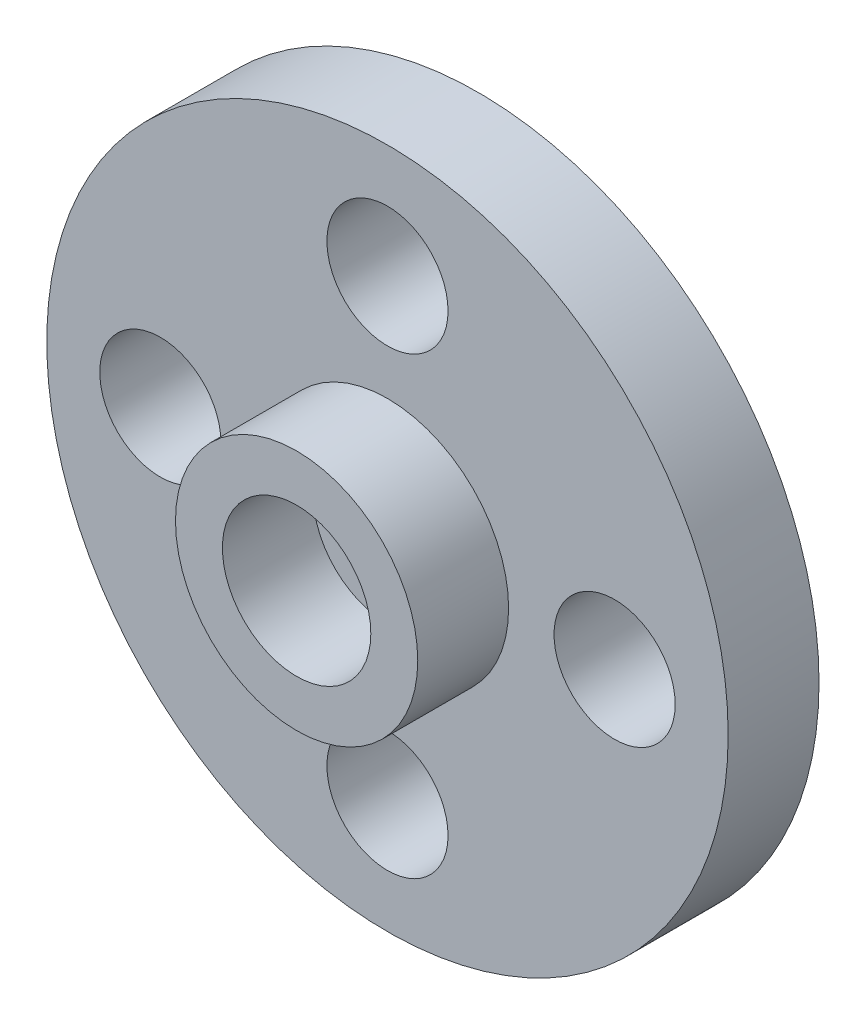
ISO-10303-21;
HEADER;
FILE_DESCRIPTION(('STEP AP214'),'2;1');
FILE_NAME('part.step','',(''),(''),'','','');
FILE_SCHEMA(('AUTOMOTIVE_DESIGN { 1 0 10303 214 1 1 1 1 }'));
ENDSEC;
DATA;
#1=APPLICATION_CONTEXT('core data for automotive mechanical design processes');
#2=APPLICATION_PROTOCOL_DEFINITION('international standard','automotive_design',2000,#1);
#3=PRODUCT_CONTEXT('',#1,'mechanical');
#4=PRODUCT('Part','Part','',(#3));
#5=PRODUCT_RELATED_PRODUCT_CATEGORY('part','',(#4));
#6=PRODUCT_DEFINITION_FORMATION('','',#4);
#7=PRODUCT_DEFINITION_CONTEXT('part definition',#1,'design');
#8=PRODUCT_DEFINITION('design','',#6,#7);
#9=PRODUCT_DEFINITION_SHAPE('','',#8);
#10=(LENGTH_UNIT() NAMED_UNIT(*) SI_UNIT(.MILLI.,.METRE.));
#11=(NAMED_UNIT(*) PLANE_ANGLE_UNIT() SI_UNIT($,.RADIAN.));
#12=(NAMED_UNIT(*) SI_UNIT($,.STERADIAN.) SOLID_ANGLE_UNIT());
#13=UNCERTAINTY_MEASURE_WITH_UNIT(LENGTH_MEASURE(1.E-05),#10,'distance_accuracy_value','');
#14=(GEOMETRIC_REPRESENTATION_CONTEXT(3) GLOBAL_UNCERTAINTY_ASSIGNED_CONTEXT((#13)) GLOBAL_UNIT_ASSIGNED_CONTEXT((#10,
#11,#12)) REPRESENTATION_CONTEXT('',''));
#15=CARTESIAN_POINT('',(0.,0.,0.));
#16=DIRECTION('',(0.,0.,1.));
#17=DIRECTION('',(1.,0.,0.));
#18=AXIS2_PLACEMENT_3D('',#15,#16,#17);
#19=CARTESIAN_POINT('',(0.,0.,-3.));
#20=DIRECTION('',(0.,0.,1.));
#21=DIRECTION('',(1.,0.,0.));
#22=AXIS2_PLACEMENT_3D('',#19,#20,#21);
#23=CYLINDRICAL_SURFACE('',#22,11.25);
#24=CARTESIAN_POINT('',(0.,0.,-3.));
#25=DIRECTION('',(0.,0.,1.));
#26=DIRECTION('',(1.,0.,0.));
#27=AXIS2_PLACEMENT_3D('',#24,#25,#26);
#28=CIRCLE('',#27,11.25);
#29=CARTESIAN_POINT('',(11.25,0.,-3.));
#30=VERTEX_POINT('',#29);
#31=EDGE_CURVE('E52',#30,#30,#28,.T.);
#32=ORIENTED_EDGE('',*,*,#31,.T.);
#33=EDGE_LOOP('',(#32));
#34=FACE_BOUND('',#33,.T.);
#35=CARTESIAN_POINT('',(0.,0.,0.));
#36=DIRECTION('',(0.,0.,1.));
#37=DIRECTION('',(1.,0.,0.));
#38=AXIS2_PLACEMENT_3D('',#35,#36,#37);
#39=CIRCLE('',#38,11.25);
#40=CARTESIAN_POINT('',(11.25,0.,0.));
#41=VERTEX_POINT('',#40);
#42=EDGE_CURVE('E59',#41,#41,#39,.T.);
#43=ORIENTED_EDGE('',*,*,#42,.F.);
#44=EDGE_LOOP('',(#43));
#45=FACE_BOUND('',#44,.T.);
#46=ADVANCED_FACE('F45',(#34,#45),#23,.T.);
#47=CARTESIAN_POINT('',(0.,0.,-3.));
#48=DIRECTION('',(0.,0.,1.));
#49=DIRECTION('',(1.,0.,0.));
#50=AXIS2_PLACEMENT_3D('',#47,#48,#49);
#51=PLANE('',#50);
#52=CARTESIAN_POINT('',(0.,7.5,-3.));
#53=DIRECTION('',(0.,0.,1.));
#54=DIRECTION('',(1.,0.,0.));
#55=AXIS2_PLACEMENT_3D('',#52,#53,#54);
#56=CIRCLE('',#55,2.);
#57=CARTESIAN_POINT('',(2.,7.5,-3.));
#58=VERTEX_POINT('',#57);
#59=EDGE_CURVE('E79',#58,#58,#56,.F.);
#60=ORIENTED_EDGE('',*,*,#59,.F.);
#61=EDGE_LOOP('',(#60));
#62=FACE_BOUND('',#61,.T.);
#63=CARTESIAN_POINT('',(7.5,0.,-3.));
#64=DIRECTION('',(0.,0.,1.));
#65=DIRECTION('',(1.,0.,0.));
#66=AXIS2_PLACEMENT_3D('',#63,#64,#65);
#67=CIRCLE('',#66,2.);
#68=CARTESIAN_POINT('',(9.5,0.,-3.));
#69=VERTEX_POINT('',#68);
#70=EDGE_CURVE('E103',#69,#69,#67,.F.);
#71=ORIENTED_EDGE('',*,*,#70,.F.);
#72=EDGE_LOOP('',(#71));
#73=FACE_BOUND('',#72,.T.);
#74=CARTESIAN_POINT('',(2.11325850529309E-13,-7.5,-3.));
#75=DIRECTION('',(0.,0.,1.));
#76=DIRECTION('',(1.,0.,0.));
#77=AXIS2_PLACEMENT_3D('',#74,#75,#76);
#78=CIRCLE('',#77,2.00000000000025);
#79=CARTESIAN_POINT('',(2.00000000000046,-7.5,-3.));
#80=VERTEX_POINT('',#79);
#81=EDGE_CURVE('E90',#80,#80,#78,.F.);
#82=ORIENTED_EDGE('',*,*,#81,.F.);
#83=EDGE_LOOP('',(#82));
#84=FACE_BOUND('',#83,.T.);
#85=CARTESIAN_POINT('',(-7.4999999999999,-1.06581410364015E-13,-3.));
#86=DIRECTION('',(0.,0.,1.));
#87=DIRECTION('',(1.,0.,0.));
#88=AXIS2_PLACEMENT_3D('',#85,#86,#87);
#89=CIRCLE('',#88,2.00000000000021);
#90=CARTESIAN_POINT('',(-5.49999999999969,-1.06581410364015E-13,-3.));
#91=VERTEX_POINT('',#90);
#92=EDGE_CURVE('E80',#91,#91,#89,.F.);
#93=ORIENTED_EDGE('',*,*,#92,.F.);
#94=EDGE_LOOP('',(#93));
#95=FACE_BOUND('',#94,.T.);
#96=ORIENTED_EDGE('',*,*,#31,.F.);
#97=EDGE_LOOP('',(#96));
#98=FACE_BOUND('',#97,.T.);
#99=ADVANCED_FACE('F129',(#62,#73,#84,#95,#98),#51,.F.);
#100=CARTESIAN_POINT('',(0.,0.,0.));
#101=DIRECTION('',(0.,0.,1.));
#102=DIRECTION('',(1.,0.,0.));
#103=AXIS2_PLACEMENT_3D('',#100,#101,#102);
#104=PLANE('',#103);
#105=CARTESIAN_POINT('',(0.,7.5,0.));
#106=DIRECTION('',(0.,0.,1.));
#107=DIRECTION('',(1.,0.,0.));
#108=AXIS2_PLACEMENT_3D('',#105,#106,#107);
#109=CIRCLE('',#108,2.);
#110=CARTESIAN_POINT('',(2.,7.5,0.));
#111=VERTEX_POINT('',#110);
#112=EDGE_CURVE('E114',#111,#111,#109,.T.);
#113=ORIENTED_EDGE('',*,*,#112,.F.);
#114=EDGE_LOOP('',(#113));
#115=FACE_BOUND('',#114,.T.);
#116=CARTESIAN_POINT('',(7.5,0.,0.));
#117=DIRECTION('',(0.,0.,1.));
#118=DIRECTION('',(1.,0.,0.));
#119=AXIS2_PLACEMENT_3D('',#116,#117,#118);
#120=CIRCLE('',#119,2.);
#121=CARTESIAN_POINT('',(9.5,0.,0.));
#122=VERTEX_POINT('',#121);
#123=EDGE_CURVE('E106',#122,#122,#120,.T.);
#124=ORIENTED_EDGE('',*,*,#123,.F.);
#125=EDGE_LOOP('',(#124));
#126=FACE_BOUND('',#125,.T.);
#127=CARTESIAN_POINT('',(2.11325850529309E-13,-7.5,0.));
#128=DIRECTION('',(0.,0.,1.));
#129=DIRECTION('',(1.,0.,0.));
#130=AXIS2_PLACEMENT_3D('',#127,#128,#129);
#131=CIRCLE('',#130,2.00000000000025);
#132=CARTESIAN_POINT('',(2.00000000000046,-7.5,0.));
#133=VERTEX_POINT('',#132);
#134=EDGE_CURVE('E84',#133,#133,#131,.T.);
#135=ORIENTED_EDGE('',*,*,#134,.F.);
#136=EDGE_LOOP('',(#135));
#137=FACE_BOUND('',#136,.T.);
#138=CARTESIAN_POINT('',(-7.4999999999999,-1.06581410364015E-13,0.));
#139=DIRECTION('',(0.,0.,1.));
#140=DIRECTION('',(1.,0.,0.));
#141=AXIS2_PLACEMENT_3D('',#138,#139,#140);
#142=CIRCLE('',#141,2.00000000000021);
#143=CARTESIAN_POINT('',(-5.49999999999969,-1.06581410364015E-13,0.));
#144=VERTEX_POINT('',#143);
#145=EDGE_CURVE('E85',#144,#144,#142,.T.);
#146=ORIENTED_EDGE('',*,*,#145,.F.);
#147=EDGE_LOOP('',(#146));
#148=FACE_BOUND('',#147,.T.);
#149=CARTESIAN_POINT('',(0.,0.,0.));
#150=DIRECTION('',(0.,0.,1.));
#151=DIRECTION('',(1.,0.,0.));
#152=AXIS2_PLACEMENT_3D('',#149,#150,#151);
#153=CIRCLE('',#152,4.);
#154=CARTESIAN_POINT('',(4.,0.,0.));
#155=VERTEX_POINT('',#154);
#156=EDGE_CURVE('E69',#155,#155,#153,.T.);
#157=ORIENTED_EDGE('',*,*,#156,.F.);
#158=EDGE_LOOP('',(#157));
#159=FACE_BOUND('',#158,.T.);
#160=ORIENTED_EDGE('',*,*,#42,.T.);
#161=EDGE_LOOP('',(#160));
#162=FACE_BOUND('',#161,.T.);
#163=ADVANCED_FACE('F132',(#115,#126,#137,#148,#159,#162),#104,.T.);
#164=CARTESIAN_POINT('',(0.,0.,3.));
#165=DIRECTION('',(0.,0.,1.));
#166=DIRECTION('',(1.,0.,0.));
#167=AXIS2_PLACEMENT_3D('',#164,#165,#166);
#168=PLANE('',#167);
#169=CARTESIAN_POINT('',(0.,0.,3.));
#170=DIRECTION('',(0.,0.,1.));
#171=DIRECTION('',(1.,0.,0.));
#172=AXIS2_PLACEMENT_3D('',#169,#170,#171);
#173=CIRCLE('',#172,4.);
#174=CARTESIAN_POINT('',(4.,0.,3.));
#175=VERTEX_POINT('',#174);
#176=EDGE_CURVE('E67',#175,#175,#173,.T.);
#177=ORIENTED_EDGE('',*,*,#176,.T.);
#178=EDGE_LOOP('',(#177));
#179=FACE_BOUND('',#178,.T.);
#180=CARTESIAN_POINT('',(0.,0.,3.));
#181=DIRECTION('',(0.,0.,1.));
#182=DIRECTION('',(1.,0.,0.));
#183=AXIS2_PLACEMENT_3D('',#180,#181,#182);
#184=CIRCLE('',#183,2.45);
#185=CARTESIAN_POINT('',(2.45,0.,3.));
#186=VERTEX_POINT('',#185);
#187=EDGE_CURVE('E72',#186,#186,#184,.T.);
#188=ORIENTED_EDGE('',*,*,#187,.F.);
#189=EDGE_LOOP('',(#188));
#190=FACE_BOUND('',#189,.T.);
#191=ADVANCED_FACE('F163',(#179,#190),#168,.T.);
#192=CARTESIAN_POINT('',(0.,0.,3.));
#193=DIRECTION('',(0.,0.,-1.));
#194=DIRECTION('',(-1.,0.,0.));
#195=AXIS2_PLACEMENT_3D('',#192,#193,#194);
#196=CYLINDRICAL_SURFACE('',#195,4.);
#197=ORIENTED_EDGE('',*,*,#176,.F.);
#198=EDGE_LOOP('',(#197));
#199=FACE_BOUND('',#198,.T.);
#200=ORIENTED_EDGE('',*,*,#156,.T.);
#201=EDGE_LOOP('',(#200));
#202=FACE_BOUND('',#201,.T.);
#203=ADVANCED_FACE('F168',(#199,#202),#196,.T.);
#204=CARTESIAN_POINT('',(0.,0.,3.));
#205=DIRECTION('',(0.,0.,-1.));
#206=DIRECTION('',(-1.,0.,0.));
#207=AXIS2_PLACEMENT_3D('',#204,#205,#206);
#208=CYLINDRICAL_SURFACE('',#207,2.45);
#209=ORIENTED_EDGE('',*,*,#187,.T.);
#210=EDGE_LOOP('',(#209));
#211=FACE_BOUND('',#210,.T.);
#212=CARTESIAN_POINT('',(0.,0.,0.));
#213=DIRECTION('',(0.,0.,1.));
#214=DIRECTION('',(1.,0.,0.));
#215=AXIS2_PLACEMENT_3D('',#212,#213,#214);
#216=CIRCLE('',#215,2.45);
#217=CARTESIAN_POINT('',(2.45,0.,0.));
#218=VERTEX_POINT('',#217);
#219=EDGE_CURVE('E11',#218,#218,#216,.F.);
#220=ORIENTED_EDGE('',*,*,#219,.T.);
#221=EDGE_LOOP('',(#220));
#222=FACE_BOUND('',#221,.T.);
#223=ADVANCED_FACE('F153',(#211,#222),#208,.F.);
#224=ORIENTED_EDGE('',*,*,#219,.F.);
#225=EDGE_LOOP('',(#224));
#226=FACE_BOUND('',#225,.T.);
#227=ADVANCED_FACE('F144',(#226),#104,.T.);
#228=CARTESIAN_POINT('',(-7.4999999999999,-1.06581410364015E-13,-3.001));
#229=DIRECTION('',(0.,0.,1.));
#230=DIRECTION('',(1.,0.,0.));
#231=AXIS2_PLACEMENT_3D('',#228,#229,#230);
#232=CYLINDRICAL_SURFACE('',#231,2.00000000000021);
#233=CARTESIAN_POINT('',(-5.49999999999969,-1.06581410364015E-13,0.));
#234=CARTESIAN_POINT('',(-5.49999999999969,-1.06581410364015E-13,-0.0312500000000005));
#235=CARTESIAN_POINT('',(-5.49999999999969,-1.06581410364015E-13,-0.0625000000000005));
#236=CARTESIAN_POINT('',(-5.49999999999969,-1.06581410364015E-13,-0.125000000000001));
#237=CARTESIAN_POINT('',(-5.49999999999969,-1.06581410364015E-13,-0.156250000000001));
#238=CARTESIAN_POINT('',(-5.49999999999969,-1.06581410364015E-13,-0.218750000000001));
#239=CARTESIAN_POINT('',(-5.49999999999969,-1.06581410364015E-13,-0.250000000000001));
#240=CARTESIAN_POINT('',(-5.49999999999969,-1.06581410364015E-13,-0.312500000000001));
#241=CARTESIAN_POINT('',(-5.49999999999969,-1.06581410364015E-13,-0.34375));
#242=CARTESIAN_POINT('',(-5.49999999999969,-1.06581410364015E-13,-0.40625));
#243=CARTESIAN_POINT('',(-5.49999999999969,-1.06581410364015E-13,-0.4375));
#244=CARTESIAN_POINT('',(-5.49999999999969,-1.06581410364015E-13,-0.5));
#245=CARTESIAN_POINT('',(-5.49999999999969,-1.06581410364015E-13,-0.53125));
#246=CARTESIAN_POINT('',(-5.49999999999969,-1.06581410364015E-13,-0.593750000000001));
#247=CARTESIAN_POINT('',(-5.49999999999969,-1.06581410364015E-13,-0.625000000000001));
#248=CARTESIAN_POINT('',(-5.49999999999969,-1.06581410364015E-13,-0.687500000000001));
#249=CARTESIAN_POINT('',(-5.49999999999969,-1.06581410364015E-13,-0.71875));
#250=CARTESIAN_POINT('',(-5.49999999999969,-1.06581410364015E-13,-0.78125));
#251=CARTESIAN_POINT('',(-5.49999999999969,-1.06581410364015E-13,-0.8125));
#252=CARTESIAN_POINT('',(-5.49999999999969,-1.06581410364015E-13,-0.875));
#253=CARTESIAN_POINT('',(-5.49999999999969,-1.06581410364015E-13,-0.90625));
#254=CARTESIAN_POINT('',(-5.49999999999969,-1.06581410364015E-13,-0.96875));
#255=CARTESIAN_POINT('',(-5.49999999999969,-1.06581410364015E-13,-1.));
#256=CARTESIAN_POINT('',(-5.49999999999969,-1.06581410364015E-13,-1.0625));
#257=CARTESIAN_POINT('',(-5.49999999999969,-1.06581410364015E-13,-1.09375));
#258=CARTESIAN_POINT('',(-5.49999999999969,-1.06581410364015E-13,-1.15625));
#259=CARTESIAN_POINT('',(-5.49999999999969,-1.06581410364015E-13,-1.1875));
#260=CARTESIAN_POINT('',(-5.49999999999969,-1.06581410364015E-13,-1.25));
#261=CARTESIAN_POINT('',(-5.49999999999969,-1.06581410364015E-13,-1.28125));
#262=CARTESIAN_POINT('',(-5.49999999999969,-1.06581410364015E-13,-1.34375));
#263=CARTESIAN_POINT('',(-5.49999999999969,-1.06581410364015E-13,-1.375));
#264=CARTESIAN_POINT('',(-5.49999999999969,-1.06581410364015E-13,-1.4375));
#265=CARTESIAN_POINT('',(-5.49999999999969,-1.06581410364015E-13,-1.46875));
#266=CARTESIAN_POINT('',(-5.49999999999969,-1.06581410364015E-13,-1.53125));
#267=CARTESIAN_POINT('',(-5.49999999999969,-1.06581410364015E-13,-1.5625));
#268=CARTESIAN_POINT('',(-5.49999999999969,-1.06581410364015E-13,-1.625));
#269=CARTESIAN_POINT('',(-5.49999999999969,-1.06581410364015E-13,-1.65625));
#270=CARTESIAN_POINT('',(-5.49999999999969,-1.06581410364015E-13,-1.71875));
#271=CARTESIAN_POINT('',(-5.49999999999969,-1.06581410364015E-13,-1.75));
#272=CARTESIAN_POINT('',(-5.49999999999969,-1.06581410364015E-13,-1.8125));
#273=CARTESIAN_POINT('',(-5.49999999999969,-1.06581410364015E-13,-1.84375));
#274=CARTESIAN_POINT('',(-5.49999999999969,-1.06581410364015E-13,-1.90625));
#275=CARTESIAN_POINT('',(-5.49999999999969,-1.06581410364015E-13,-1.9375));
#276=CARTESIAN_POINT('',(-5.49999999999969,-1.06581410364015E-13,-2.));
#277=CARTESIAN_POINT('',(-5.49999999999969,-1.06581410364015E-13,-2.03125));
#278=CARTESIAN_POINT('',(-5.49999999999969,-1.06581410364015E-13,-2.09375));
#279=CARTESIAN_POINT('',(-5.49999999999969,-1.06581410364015E-13,-2.125));
#280=CARTESIAN_POINT('',(-5.49999999999969,-1.06581410364015E-13,-2.1875));
#281=CARTESIAN_POINT('',(-5.49999999999969,-1.06581410364015E-13,-2.21875));
#282=CARTESIAN_POINT('',(-5.49999999999969,-1.06581410364015E-13,-2.28125));
#283=CARTESIAN_POINT('',(-5.49999999999969,-1.06581410364015E-13,-2.3125));
#284=CARTESIAN_POINT('',(-5.49999999999969,-1.06581410364015E-13,-2.375));
#285=CARTESIAN_POINT('',(-5.49999999999969,-1.06581410364015E-13,-2.40625));
#286=CARTESIAN_POINT('',(-5.49999999999969,-1.06581410364015E-13,-2.46875));
#287=CARTESIAN_POINT('',(-5.49999999999969,-1.06581410364015E-13,-2.5));
#288=CARTESIAN_POINT('',(-5.49999999999969,-1.06581410364015E-13,-2.5625));
#289=CARTESIAN_POINT('',(-5.49999999999969,-1.06581410364015E-13,-2.59375));
#290=CARTESIAN_POINT('',(-5.49999999999969,-1.06581410364015E-13,-2.65625));
#291=CARTESIAN_POINT('',(-5.49999999999969,-1.06581410364015E-13,-2.6875));
#292=CARTESIAN_POINT('',(-5.49999999999969,-1.06581410364015E-13,-2.75));
#293=CARTESIAN_POINT('',(-5.49999999999969,-1.06581410364015E-13,-2.78125));
#294=CARTESIAN_POINT('',(-5.49999999999969,-1.06581410364015E-13,-2.84375));
#295=CARTESIAN_POINT('',(-5.49999999999969,-1.06581410364015E-13,-2.875));
#296=CARTESIAN_POINT('',(-5.49999999999969,-1.06581410364015E-13,-2.9375));
#297=CARTESIAN_POINT('',(-5.49999999999969,-1.06581410364015E-13,-2.96875));
#298=CARTESIAN_POINT('',(-5.49999999999969,-1.06581410364015E-13,-3.));
#299=B_SPLINE_CURVE_WITH_KNOTS('',3,(#233,#234,#235,#236,#237,#238,#239,#240,#241,#242,#243,
#244,#245,#246,#247,#248,#249,#250,#251,#252,#253,#254,#255,#256,#257,#258,#259,#260,#261,#262,
#263,#264,#265,#266,#267,#268,#269,#270,#271,#272,#273,#274,#275,#276,#277,#278,#279,#280,#281,
#282,#283,#284,#285,#286,#287,#288,#289,#290,#291,#292,#293,#294,#295,#296,#297,#298),
.UNSPECIFIED.,.F.,.F.,(4,2,2,2,2,2,2,2,2,2,2,2,2,2,2,2,2,2,2,2,2,2,2,2,2,2,2,2,2,2,2,2,4),(0.,
0.0937500000000001,0.1875,0.28125,0.375,0.46875,0.5625,0.65625,0.75,0.84375,0.9375,1.03125,
1.125,1.21875,1.3125,1.40625,1.5,1.59375,1.6875,1.78125,1.875,1.96875,2.0625,2.15625,2.25,
2.34375,2.4375,2.53125,2.625,2.71875,2.8125,2.90625,3.),.UNSPECIFIED.);
#300=EDGE_CURVE('BSEAM141',#144,#91,#299,.T.);
#301=ORIENTED_EDGE('',*,*,#145,.T.);
#302=ORIENTED_EDGE('',*,*,#92,.T.);
#303=ORIENTED_EDGE('',*,*,#300,.T.);
#304=ORIENTED_EDGE('',*,*,#300,.F.);
#305=EDGE_LOOP('',(#301,#303,#302,#304));
#306=FACE_BOUND('',#305,.T.);
#307=ADVANCED_FACE('F141',(#306),#232,.F.);
#308=CARTESIAN_POINT('',(2.11325850529309E-13,-7.5,-3.001));
#309=DIRECTION('',(0.,0.,1.));
#310=DIRECTION('',(1.,0.,0.));
#311=AXIS2_PLACEMENT_3D('',#308,#309,#310);
#312=CYLINDRICAL_SURFACE('',#311,2.00000000000025);
#313=CARTESIAN_POINT('',(2.00000000000046,-7.5,0.));
#314=CARTESIAN_POINT('',(2.00000000000046,-7.5,-0.0312500000000005));
#315=CARTESIAN_POINT('',(2.00000000000046,-7.5,-0.0625000000000005));
#316=CARTESIAN_POINT('',(2.00000000000046,-7.5,-0.125000000000001));
#317=CARTESIAN_POINT('',(2.00000000000046,-7.5,-0.156250000000001));
#318=CARTESIAN_POINT('',(2.00000000000046,-7.5,-0.218750000000001));
#319=CARTESIAN_POINT('',(2.00000000000046,-7.5,-0.250000000000001));
#320=CARTESIAN_POINT('',(2.00000000000046,-7.5,-0.312500000000001));
#321=CARTESIAN_POINT('',(2.00000000000046,-7.5,-0.34375));
#322=CARTESIAN_POINT('',(2.00000000000046,-7.5,-0.40625));
#323=CARTESIAN_POINT('',(2.00000000000046,-7.5,-0.4375));
#324=CARTESIAN_POINT('',(2.00000000000046,-7.5,-0.5));
#325=CARTESIAN_POINT('',(2.00000000000046,-7.5,-0.53125));
#326=CARTESIAN_POINT('',(2.00000000000046,-7.5,-0.593750000000001));
#327=CARTESIAN_POINT('',(2.00000000000046,-7.5,-0.625000000000001));
#328=CARTESIAN_POINT('',(2.00000000000046,-7.5,-0.687500000000001));
#329=CARTESIAN_POINT('',(2.00000000000046,-7.5,-0.71875));
#330=CARTESIAN_POINT('',(2.00000000000046,-7.5,-0.78125));
#331=CARTESIAN_POINT('',(2.00000000000046,-7.5,-0.8125));
#332=CARTESIAN_POINT('',(2.00000000000046,-7.5,-0.875));
#333=CARTESIAN_POINT('',(2.00000000000046,-7.5,-0.90625));
#334=CARTESIAN_POINT('',(2.00000000000046,-7.5,-0.96875));
#335=CARTESIAN_POINT('',(2.00000000000046,-7.5,-1.));
#336=CARTESIAN_POINT('',(2.00000000000046,-7.5,-1.0625));
#337=CARTESIAN_POINT('',(2.00000000000046,-7.5,-1.09375));
#338=CARTESIAN_POINT('',(2.00000000000046,-7.5,-1.15625));
#339=CARTESIAN_POINT('',(2.00000000000046,-7.5,-1.1875));
#340=CARTESIAN_POINT('',(2.00000000000046,-7.5,-1.25));
#341=CARTESIAN_POINT('',(2.00000000000046,-7.5,-1.28125));
#342=CARTESIAN_POINT('',(2.00000000000046,-7.5,-1.34375));
#343=CARTESIAN_POINT('',(2.00000000000046,-7.5,-1.375));
#344=CARTESIAN_POINT('',(2.00000000000046,-7.5,-1.4375));
#345=CARTESIAN_POINT('',(2.00000000000046,-7.5,-1.46875));
#346=CARTESIAN_POINT('',(2.00000000000046,-7.5,-1.53125));
#347=CARTESIAN_POINT('',(2.00000000000046,-7.5,-1.5625));
#348=CARTESIAN_POINT('',(2.00000000000046,-7.5,-1.625));
#349=CARTESIAN_POINT('',(2.00000000000046,-7.5,-1.65625));
#350=CARTESIAN_POINT('',(2.00000000000046,-7.5,-1.71875));
#351=CARTESIAN_POINT('',(2.00000000000046,-7.5,-1.75));
#352=CARTESIAN_POINT('',(2.00000000000046,-7.5,-1.8125));
#353=CARTESIAN_POINT('',(2.00000000000046,-7.5,-1.84375));
#354=CARTESIAN_POINT('',(2.00000000000046,-7.5,-1.90625));
#355=CARTESIAN_POINT('',(2.00000000000046,-7.5,-1.9375));
#356=CARTESIAN_POINT('',(2.00000000000046,-7.5,-2.));
#357=CARTESIAN_POINT('',(2.00000000000046,-7.5,-2.03125));
#358=CARTESIAN_POINT('',(2.00000000000046,-7.5,-2.09375));
#359=CARTESIAN_POINT('',(2.00000000000046,-7.5,-2.125));
#360=CARTESIAN_POINT('',(2.00000000000046,-7.5,-2.1875));
#361=CARTESIAN_POINT('',(2.00000000000046,-7.5,-2.21875));
#362=CARTESIAN_POINT('',(2.00000000000046,-7.5,-2.28125));
#363=CARTESIAN_POINT('',(2.00000000000046,-7.5,-2.3125));
#364=CARTESIAN_POINT('',(2.00000000000046,-7.5,-2.375));
#365=CARTESIAN_POINT('',(2.00000000000046,-7.5,-2.40625));
#366=CARTESIAN_POINT('',(2.00000000000046,-7.5,-2.46875));
#367=CARTESIAN_POINT('',(2.00000000000046,-7.5,-2.5));
#368=CARTESIAN_POINT('',(2.00000000000046,-7.5,-2.5625));
#369=CARTESIAN_POINT('',(2.00000000000046,-7.5,-2.59375));
#370=CARTESIAN_POINT('',(2.00000000000046,-7.5,-2.65625));
#371=CARTESIAN_POINT('',(2.00000000000046,-7.5,-2.6875));
#372=CARTESIAN_POINT('',(2.00000000000046,-7.5,-2.75));
#373=CARTESIAN_POINT('',(2.00000000000046,-7.5,-2.78125));
#374=CARTESIAN_POINT('',(2.00000000000046,-7.5,-2.84375));
#375=CARTESIAN_POINT('',(2.00000000000046,-7.5,-2.875));
#376=CARTESIAN_POINT('',(2.00000000000046,-7.5,-2.9375));
#377=CARTESIAN_POINT('',(2.00000000000046,-7.5,-2.96875));
#378=CARTESIAN_POINT('',(2.00000000000046,-7.5,-3.));
#379=B_SPLINE_CURVE_WITH_KNOTS('',3,(#313,#314,#315,#316,#317,#318,#319,#320,#321,#322,#323,
#324,#325,#326,#327,#328,#329,#330,#331,#332,#333,#334,#335,#336,#337,#338,#339,#340,#341,#342,
#343,#344,#345,#346,#347,#348,#349,#350,#351,#352,#353,#354,#355,#356,#357,#358,#359,#360,#361,
#362,#363,#364,#365,#366,#367,#368,#369,#370,#371,#372,#373,#374,#375,#376,#377,#378),
.UNSPECIFIED.,.F.,.F.,(4,2,2,2,2,2,2,2,2,2,2,2,2,2,2,2,2,2,2,2,2,2,2,2,2,2,2,2,2,2,2,2,4),(0.,
0.0937500000000001,0.1875,0.28125,0.375,0.46875,0.5625,0.65625,0.75,0.84375,0.9375,1.03125,
1.125,1.21875,1.3125,1.40625,1.5,1.59375,1.6875,1.78125,1.875,1.96875,2.0625,2.15625,2.25,
2.34375,2.4375,2.53125,2.625,2.71875,2.8125,2.90625,3.),.UNSPECIFIED.);
#380=EDGE_CURVE('BSEAM143',#133,#80,#379,.T.);
#381=ORIENTED_EDGE('',*,*,#134,.T.);
#382=ORIENTED_EDGE('',*,*,#81,.T.);
#383=ORIENTED_EDGE('',*,*,#380,.T.);
#384=ORIENTED_EDGE('',*,*,#380,.F.);
#385=EDGE_LOOP('',(#381,#383,#382,#384));
#386=FACE_BOUND('',#385,.T.);
#387=ADVANCED_FACE('F143',(#386),#312,.F.);
#388=CARTESIAN_POINT('',(7.5,0.,-3.001));
#389=DIRECTION('',(0.,0.,1.));
#390=DIRECTION('',(1.,0.,0.));
#391=AXIS2_PLACEMENT_3D('',#388,#389,#390);
#392=CYLINDRICAL_SURFACE('',#391,2.);
#393=CARTESIAN_POINT('',(9.5,0.,0.));
#394=CARTESIAN_POINT('',(9.5,0.,-0.0312500000000005));
#395=CARTESIAN_POINT('',(9.5,0.,-0.0625000000000005));
#396=CARTESIAN_POINT('',(9.5,0.,-0.125000000000001));
#397=CARTESIAN_POINT('',(9.5,0.,-0.156250000000001));
#398=CARTESIAN_POINT('',(9.5,0.,-0.218750000000001));
#399=CARTESIAN_POINT('',(9.5,0.,-0.250000000000001));
#400=CARTESIAN_POINT('',(9.5,0.,-0.312500000000001));
#401=CARTESIAN_POINT('',(9.5,0.,-0.34375));
#402=CARTESIAN_POINT('',(9.5,0.,-0.40625));
#403=CARTESIAN_POINT('',(9.5,0.,-0.4375));
#404=CARTESIAN_POINT('',(9.5,0.,-0.5));
#405=CARTESIAN_POINT('',(9.5,0.,-0.53125));
#406=CARTESIAN_POINT('',(9.5,0.,-0.593750000000001));
#407=CARTESIAN_POINT('',(9.5,0.,-0.625000000000001));
#408=CARTESIAN_POINT('',(9.5,0.,-0.687500000000001));
#409=CARTESIAN_POINT('',(9.5,0.,-0.71875));
#410=CARTESIAN_POINT('',(9.5,0.,-0.78125));
#411=CARTESIAN_POINT('',(9.5,0.,-0.8125));
#412=CARTESIAN_POINT('',(9.5,0.,-0.875));
#413=CARTESIAN_POINT('',(9.5,0.,-0.90625));
#414=CARTESIAN_POINT('',(9.5,0.,-0.96875));
#415=CARTESIAN_POINT('',(9.5,0.,-1.));
#416=CARTESIAN_POINT('',(9.5,0.,-1.0625));
#417=CARTESIAN_POINT('',(9.5,0.,-1.09375));
#418=CARTESIAN_POINT('',(9.5,0.,-1.15625));
#419=CARTESIAN_POINT('',(9.5,0.,-1.1875));
#420=CARTESIAN_POINT('',(9.5,0.,-1.25));
#421=CARTESIAN_POINT('',(9.5,0.,-1.28125));
#422=CARTESIAN_POINT('',(9.5,0.,-1.34375));
#423=CARTESIAN_POINT('',(9.5,0.,-1.375));
#424=CARTESIAN_POINT('',(9.5,0.,-1.4375));
#425=CARTESIAN_POINT('',(9.5,0.,-1.46875));
#426=CARTESIAN_POINT('',(9.5,0.,-1.53125));
#427=CARTESIAN_POINT('',(9.5,0.,-1.5625));
#428=CARTESIAN_POINT('',(9.5,0.,-1.625));
#429=CARTESIAN_POINT('',(9.5,0.,-1.65625));
#430=CARTESIAN_POINT('',(9.5,0.,-1.71875));
#431=CARTESIAN_POINT('',(9.5,0.,-1.75));
#432=CARTESIAN_POINT('',(9.5,0.,-1.8125));
#433=CARTESIAN_POINT('',(9.5,0.,-1.84375));
#434=CARTESIAN_POINT('',(9.5,0.,-1.90625));
#435=CARTESIAN_POINT('',(9.5,0.,-1.9375));
#436=CARTESIAN_POINT('',(9.5,0.,-2.));
#437=CARTESIAN_POINT('',(9.5,0.,-2.03125));
#438=CARTESIAN_POINT('',(9.5,0.,-2.09375));
#439=CARTESIAN_POINT('',(9.5,0.,-2.125));
#440=CARTESIAN_POINT('',(9.5,0.,-2.1875));
#441=CARTESIAN_POINT('',(9.5,0.,-2.21875));
#442=CARTESIAN_POINT('',(9.5,0.,-2.28125));
#443=CARTESIAN_POINT('',(9.5,0.,-2.3125));
#444=CARTESIAN_POINT('',(9.5,0.,-2.375));
#445=CARTESIAN_POINT('',(9.5,0.,-2.40625));
#446=CARTESIAN_POINT('',(9.5,0.,-2.46875));
#447=CARTESIAN_POINT('',(9.5,0.,-2.5));
#448=CARTESIAN_POINT('',(9.5,0.,-2.5625));
#449=CARTESIAN_POINT('',(9.5,0.,-2.59375));
#450=CARTESIAN_POINT('',(9.5,0.,-2.65625));
#451=CARTESIAN_POINT('',(9.5,0.,-2.6875));
#452=CARTESIAN_POINT('',(9.5,0.,-2.75));
#453=CARTESIAN_POINT('',(9.5,0.,-2.78125));
#454=CARTESIAN_POINT('',(9.5,0.,-2.84375));
#455=CARTESIAN_POINT('',(9.5,0.,-2.875));
#456=CARTESIAN_POINT('',(9.5,0.,-2.9375));
#457=CARTESIAN_POINT('',(9.5,0.,-2.96875));
#458=CARTESIAN_POINT('',(9.5,0.,-3.));
#459=B_SPLINE_CURVE_WITH_KNOTS('',3,(#393,#394,#395,#396,#397,#398,#399,#400,#401,#402,#403,
#404,#405,#406,#407,#408,#409,#410,#411,#412,#413,#414,#415,#416,#417,#418,#419,#420,#421,#422,
#423,#424,#425,#426,#427,#428,#429,#430,#431,#432,#433,#434,#435,#436,#437,#438,#439,#440,#441,
#442,#443,#444,#445,#446,#447,#448,#449,#450,#451,#452,#453,#454,#455,#456,#457,#458),
.UNSPECIFIED.,.F.,.F.,(4,2,2,2,2,2,2,2,2,2,2,2,2,2,2,2,2,2,2,2,2,2,2,2,2,2,2,2,2,2,2,2,4),(0.,
0.0937500000000001,0.1875,0.28125,0.375,0.46875,0.5625,0.65625,0.75,0.84375,0.9375,1.03125,
1.125,1.21875,1.3125,1.40625,1.5,1.59375,1.6875,1.78125,1.875,1.96875,2.0625,2.15625,2.25,
2.34375,2.4375,2.53125,2.625,2.71875,2.8125,2.90625,3.),.UNSPECIFIED.);
#460=EDGE_CURVE('BSEAM127',#122,#69,#459,.T.);
#461=ORIENTED_EDGE('',*,*,#123,.T.);
#462=ORIENTED_EDGE('',*,*,#70,.T.);
#463=ORIENTED_EDGE('',*,*,#460,.T.);
#464=ORIENTED_EDGE('',*,*,#460,.F.);
#465=EDGE_LOOP('',(#461,#463,#462,#464));
#466=FACE_BOUND('',#465,.T.);
#467=ADVANCED_FACE('F127',(#466),#392,.F.);
#468=CARTESIAN_POINT('',(0.,7.5,-3.001));
#469=DIRECTION('',(0.,0.,1.));
#470=DIRECTION('',(1.,0.,0.));
#471=AXIS2_PLACEMENT_3D('',#468,#469,#470);
#472=CYLINDRICAL_SURFACE('',#471,2.);
#473=CARTESIAN_POINT('',(2.,7.5,0.));
#474=CARTESIAN_POINT('',(2.,7.5,-0.0312500000000005));
#475=CARTESIAN_POINT('',(2.,7.5,-0.0625000000000005));
#476=CARTESIAN_POINT('',(2.,7.5,-0.125000000000001));
#477=CARTESIAN_POINT('',(2.,7.5,-0.156250000000001));
#478=CARTESIAN_POINT('',(2.,7.5,-0.218750000000001));
#479=CARTESIAN_POINT('',(2.,7.5,-0.250000000000001));
#480=CARTESIAN_POINT('',(2.,7.5,-0.312500000000001));
#481=CARTESIAN_POINT('',(2.,7.5,-0.34375));
#482=CARTESIAN_POINT('',(2.,7.5,-0.40625));
#483=CARTESIAN_POINT('',(2.,7.5,-0.4375));
#484=CARTESIAN_POINT('',(2.,7.5,-0.5));
#485=CARTESIAN_POINT('',(2.,7.5,-0.53125));
#486=CARTESIAN_POINT('',(2.,7.5,-0.593750000000001));
#487=CARTESIAN_POINT('',(2.,7.5,-0.625000000000001));
#488=CARTESIAN_POINT('',(2.,7.5,-0.687500000000001));
#489=CARTESIAN_POINT('',(2.,7.5,-0.71875));
#490=CARTESIAN_POINT('',(2.,7.5,-0.78125));
#491=CARTESIAN_POINT('',(2.,7.5,-0.8125));
#492=CARTESIAN_POINT('',(2.,7.5,-0.875));
#493=CARTESIAN_POINT('',(2.,7.5,-0.90625));
#494=CARTESIAN_POINT('',(2.,7.5,-0.96875));
#495=CARTESIAN_POINT('',(2.,7.5,-1.));
#496=CARTESIAN_POINT('',(2.,7.5,-1.0625));
#497=CARTESIAN_POINT('',(2.,7.5,-1.09375));
#498=CARTESIAN_POINT('',(2.,7.5,-1.15625));
#499=CARTESIAN_POINT('',(2.,7.5,-1.1875));
#500=CARTESIAN_POINT('',(2.,7.5,-1.25));
#501=CARTESIAN_POINT('',(2.,7.5,-1.28125));
#502=CARTESIAN_POINT('',(2.,7.5,-1.34375));
#503=CARTESIAN_POINT('',(2.,7.5,-1.375));
#504=CARTESIAN_POINT('',(2.,7.5,-1.4375));
#505=CARTESIAN_POINT('',(2.,7.5,-1.46875));
#506=CARTESIAN_POINT('',(2.,7.5,-1.53125));
#507=CARTESIAN_POINT('',(2.,7.5,-1.5625));
#508=CARTESIAN_POINT('',(2.,7.5,-1.625));
#509=CARTESIAN_POINT('',(2.,7.5,-1.65625));
#510=CARTESIAN_POINT('',(2.,7.5,-1.71875));
#511=CARTESIAN_POINT('',(2.,7.5,-1.75));
#512=CARTESIAN_POINT('',(2.,7.5,-1.8125));
#513=CARTESIAN_POINT('',(2.,7.5,-1.84375));
#514=CARTESIAN_POINT('',(2.,7.5,-1.90625));
#515=CARTESIAN_POINT('',(2.,7.5,-1.9375));
#516=CARTESIAN_POINT('',(2.,7.5,-2.));
#517=CARTESIAN_POINT('',(2.,7.5,-2.03125));
#518=CARTESIAN_POINT('',(2.,7.5,-2.09375));
#519=CARTESIAN_POINT('',(2.,7.5,-2.125));
#520=CARTESIAN_POINT('',(2.,7.5,-2.1875));
#521=CARTESIAN_POINT('',(2.,7.5,-2.21875));
#522=CARTESIAN_POINT('',(2.,7.5,-2.28125));
#523=CARTESIAN_POINT('',(2.,7.5,-2.3125));
#524=CARTESIAN_POINT('',(2.,7.5,-2.375));
#525=CARTESIAN_POINT('',(2.,7.5,-2.40625));
#526=CARTESIAN_POINT('',(2.,7.5,-2.46875));
#527=CARTESIAN_POINT('',(2.,7.5,-2.5));
#528=CARTESIAN_POINT('',(2.,7.5,-2.5625));
#529=CARTESIAN_POINT('',(2.,7.5,-2.59375));
#530=CARTESIAN_POINT('',(2.,7.5,-2.65625));
#531=CARTESIAN_POINT('',(2.,7.5,-2.6875));
#532=CARTESIAN_POINT('',(2.,7.5,-2.75));
#533=CARTESIAN_POINT('',(2.,7.5,-2.78125));
#534=CARTESIAN_POINT('',(2.,7.5,-2.84375));
#535=CARTESIAN_POINT('',(2.,7.5,-2.875));
#536=CARTESIAN_POINT('',(2.,7.5,-2.9375));
#537=CARTESIAN_POINT('',(2.,7.5,-2.96875));
#538=CARTESIAN_POINT('',(2.,7.5,-3.));
#539=B_SPLINE_CURVE_WITH_KNOTS('',3,(#473,#474,#475,#476,#477,#478,#479,#480,#481,#482,#483,
#484,#485,#486,#487,#488,#489,#490,#491,#492,#493,#494,#495,#496,#497,#498,#499,#500,#501,#502,
#503,#504,#505,#506,#507,#508,#509,#510,#511,#512,#513,#514,#515,#516,#517,#518,#519,#520,#521,
#522,#523,#524,#525,#526,#527,#528,#529,#530,#531,#532,#533,#534,#535,#536,#537,#538),
.UNSPECIFIED.,.F.,.F.,(4,2,2,2,2,2,2,2,2,2,2,2,2,2,2,2,2,2,2,2,2,2,2,2,2,2,2,2,2,2,2,2,4),(0.,
0.0937500000000001,0.1875,0.28125,0.375,0.46875,0.5625,0.65625,0.75,0.84375,0.9375,1.03125,
1.125,1.21875,1.3125,1.40625,1.5,1.59375,1.6875,1.78125,1.875,1.96875,2.0625,2.15625,2.25,
2.34375,2.4375,2.53125,2.625,2.71875,2.8125,2.90625,3.),.UNSPECIFIED.);
#540=EDGE_CURVE('BSEAM214',#111,#58,#539,.T.);
#541=ORIENTED_EDGE('',*,*,#112,.T.);
#542=ORIENTED_EDGE('',*,*,#59,.T.);
#543=ORIENTED_EDGE('',*,*,#540,.T.);
#544=ORIENTED_EDGE('',*,*,#540,.F.);
#545=EDGE_LOOP('',(#541,#543,#542,#544));
#546=FACE_BOUND('',#545,.T.);
#547=ADVANCED_FACE('F214',(#546),#472,.F.);
#548=CLOSED_SHELL('',(#46,#99,#163,#191,#203,#223,#227,#307,#387,#467,#547));
#549=MANIFOLD_SOLID_BREP('B2',#548);
#550=ADVANCED_BREP_SHAPE_REPRESENTATION('',(#18,#549),#14);
#551=SHAPE_DEFINITION_REPRESENTATION(#9,#550);
ENDSEC;
END-ISO-10303-21;
